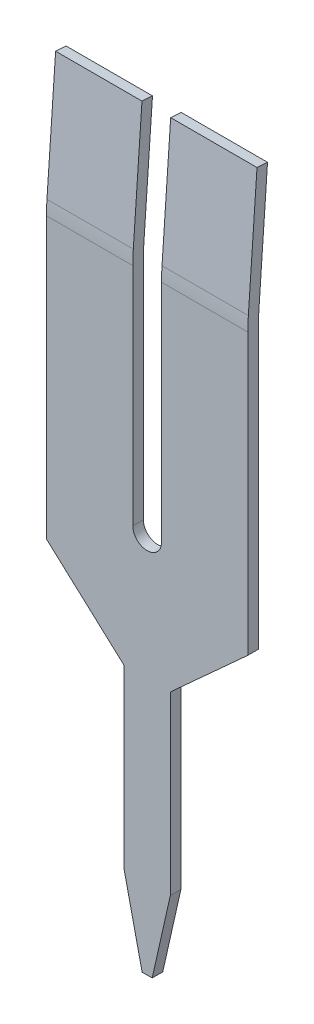
ISO-10303-21;
HEADER;
FILE_DESCRIPTION(('STEP AP214'),'2;1');
FILE_NAME('part.step','',(''),(''),'','','');
FILE_SCHEMA(('AUTOMOTIVE_DESIGN { 1 0 10303 214 1 1 1 1 }'));
ENDSEC;
DATA;
#1=APPLICATION_CONTEXT('core data for automotive mechanical design processes');
#2=APPLICATION_PROTOCOL_DEFINITION('international standard','automotive_design',2000,#1);
#3=PRODUCT_CONTEXT('',#1,'mechanical');
#4=PRODUCT('Part','Part','',(#3));
#5=PRODUCT_RELATED_PRODUCT_CATEGORY('part','',(#4));
#6=PRODUCT_DEFINITION_FORMATION('','',#4);
#7=PRODUCT_DEFINITION_CONTEXT('part definition',#1,'design');
#8=PRODUCT_DEFINITION('design','',#6,#7);
#9=PRODUCT_DEFINITION_SHAPE('','',#8);
#10=(LENGTH_UNIT() NAMED_UNIT(*) SI_UNIT(.MILLI.,.METRE.));
#11=(NAMED_UNIT(*) PLANE_ANGLE_UNIT() SI_UNIT($,.RADIAN.));
#12=(NAMED_UNIT(*) SI_UNIT($,.STERADIAN.) SOLID_ANGLE_UNIT());
#13=UNCERTAINTY_MEASURE_WITH_UNIT(LENGTH_MEASURE(1.E-05),#10,'distance_accuracy_value','');
#14=(GEOMETRIC_REPRESENTATION_CONTEXT(3) GLOBAL_UNCERTAINTY_ASSIGNED_CONTEXT((#13)) GLOBAL_UNIT_ASSIGNED_CONTEXT((#10,
#11,#12)) REPRESENTATION_CONTEXT('',''));
#15=CARTESIAN_POINT('',(0.,0.,0.));
#16=DIRECTION('',(0.,0.,1.));
#17=DIRECTION('',(1.,0.,0.));
#18=AXIS2_PLACEMENT_3D('',#15,#16,#17);
#19=CARTESIAN_POINT('',(-0.284999999999997,0.,0.21));
#20=DIRECTION('',(-1.,0.,0.));
#21=DIRECTION('',(0.,0.,1.));
#22=AXIS2_PLACEMENT_3D('',#19,#20,#21);
#23=PLANE('',#22);
#24=DIRECTION('',(0.,-0.069756473744124,-0.997564050259824));
#25=VECTOR('',#24,1.);
#26=CARTESIAN_POINT('',(-0.284999999999997,7.19254356862118,-0.292951641518469));
#27=LINE('',#26,#25);
#28=CARTESIAN_POINT('',(-0.284999999999995,7.21500000000001,0.0281902889468723));
#29=VERTEX_POINT('',#28);
#30=CARTESIAN_POINT('',(-0.284999999999995,7.2003868243992,-0.180787858270992));
#31=VERTEX_POINT('',#30);
#32=EDGE_CURVE('E456',#29,#31,#27,.T.);
#33=ORIENTED_EDGE('',*,*,#32,.F.);
#34=DIRECTION('',(0.,0.997564050259824,-0.0697564737441254));
#35=VECTOR('',#34,1.);
#36=CARTESIAN_POINT('',(-0.284999999999995,4.615,0.21));
#37=LINE('',#36,#35);
#38=CARTESIAN_POINT('',(-0.284999999999995,4.75434281700951,0.200256201039297));
#39=VERTEX_POINT('',#38);
#40=EDGE_CURVE('E429',#39,#29,#37,.T.);
#41=ORIENTED_EDGE('',*,*,#40,.F.);
#42=CARTESIAN_POINT('',(-0.284999999999997,4.47531692203301,-3.79));
#43=DIRECTION('',(-1.,0.,0.));
#44=DIRECTION('',(0.,0.,1.));
#45=AXIS2_PLACEMENT_3D('',#42,#43,#44);
#46=CIRCLE('',#45,4.);
#47=CARTESIAN_POINT('',(-0.284999999999997,4.47531692203301,0.21));
#48=VERTEX_POINT('',#47);
#49=EDGE_CURVE('E312',#39,#48,#46,.F.);
#50=ORIENTED_EDGE('',*,*,#49,.T.);
#51=DIRECTION('',(0.,1.,0.));
#52=VECTOR('',#51,1.);
#53=CARTESIAN_POINT('',(-0.284999999999997,0.,0.21));
#54=LINE('',#53,#52);
#55=CARTESIAN_POINT('',(-0.284999999999996,0.,0.21));
#56=VERTEX_POINT('',#55);
#57=EDGE_CURVE('E215',#56,#48,#54,.T.);
#58=ORIENTED_EDGE('',*,*,#57,.F.);
#59=DIRECTION('',(0.,0.,-1.));
#60=VECTOR('',#59,1.);
#61=CARTESIAN_POINT('',(-0.284999999999996,0.,0.21));
#62=LINE('',#61,#60);
#63=CARTESIAN_POINT('',(-0.284999999999996,0.,0.));
#64=VERTEX_POINT('',#63);
#65=EDGE_CURVE('E241',#56,#64,#62,.T.);
#66=ORIENTED_EDGE('',*,*,#65,.T.);
#67=DIRECTION('',(0.,1.,0.));
#68=VECTOR('',#67,1.);
#69=CARTESIAN_POINT('',(-0.284999999999997,0.,0.));
#70=LINE('',#69,#68);
#71=CARTESIAN_POINT('',(-0.284999999999997,4.47531692203302,0.));
#72=VERTEX_POINT('',#71);
#73=EDGE_CURVE('E208',#64,#72,#70,.T.);
#74=ORIENTED_EDGE('',*,*,#73,.T.);
#75=CARTESIAN_POINT('',(-0.284999999999997,4.47531692203302,-4.));
#76=DIRECTION('',(-1.,0.,0.));
#77=DIRECTION('',(0.,0.,1.));
#78=AXIS2_PLACEMENT_3D('',#75,#76,#77);
#79=CIRCLE('',#78,4.);
#80=CARTESIAN_POINT('',(-0.284999999999995,4.75434281700952,-0.00974379896070362));
#81=VERTEX_POINT('',#80);
#82=EDGE_CURVE('E317',#72,#81,#79,.T.);
#83=ORIENTED_EDGE('',*,*,#82,.T.);
#84=DIRECTION('',(0.,0.997564050259824,-0.0697564737441254));
#85=VECTOR('',#84,1.);
#86=CARTESIAN_POINT('',(-0.284999999999995,4.615,0.));
#87=LINE('',#86,#85);
#88=EDGE_CURVE('E432',#81,#31,#87,.T.);
#89=ORIENTED_EDGE('',*,*,#88,.T.);
#90=EDGE_LOOP('',(#33,#41,#50,#58,#66,#74,#83,#89));
#91=FACE_BOUND('',#90,.T.);
#92=ADVANCED_FACE('F35',(#91),#23,.F.);
#93=CARTESIAN_POINT('',(-2.,7.215,0.21));
#94=DIRECTION('',(1.,0.,0.));
#95=DIRECTION('',(0.,1.,0.));
#96=AXIS2_PLACEMENT_3D('',#93,#94,#95);
#97=PLANE('',#96);
#98=DIRECTION('',(0.,-0.069756473744124,-0.997564050259824));
#99=VECTOR('',#98,1.);
#100=CARTESIAN_POINT('',(-2.,7.21500000000001,0.0281902889468721));
#101=LINE('',#100,#99);
#102=CARTESIAN_POINT('',(-1.99999999999999,7.215,0.0281902889468727));
#103=VERTEX_POINT('',#102);
#104=CARTESIAN_POINT('',(-2.,7.2003868243992,-0.180787858270993));
#105=VERTEX_POINT('',#104);
#106=EDGE_CURVE('E204',#103,#105,#101,.T.);
#107=ORIENTED_EDGE('',*,*,#106,.T.);
#108=DIRECTION('',(0.,0.997564050259824,-0.0697564737441254));
#109=VECTOR('',#108,1.);
#110=CARTESIAN_POINT('',(-2.,4.615,0.));
#111=LINE('',#110,#109);
#112=CARTESIAN_POINT('',(-2.,4.75434281700952,-0.00974379896070362));
#113=VERTEX_POINT('',#112);
#114=EDGE_CURVE('E433',#113,#105,#111,.T.);
#115=ORIENTED_EDGE('',*,*,#114,.F.);
#116=CARTESIAN_POINT('',(-2.,4.47531692203302,-4.));
#117=DIRECTION('',(1.,0.,0.));
#118=DIRECTION('',(0.,1.,0.));
#119=AXIS2_PLACEMENT_3D('',#116,#117,#118);
#120=CIRCLE('',#119,4.);
#121=CARTESIAN_POINT('',(-2.,4.47531692203302,0.));
#122=VERTEX_POINT('',#121);
#123=EDGE_CURVE('E319',#113,#122,#120,.T.);
#124=ORIENTED_EDGE('',*,*,#123,.T.);
#125=DIRECTION('',(0.,-1.,0.));
#126=VECTOR('',#125,1.);
#127=CARTESIAN_POINT('',(-2.,7.215,0.));
#128=LINE('',#127,#126);
#129=CARTESIAN_POINT('',(-2.,-1.085,0.));
#130=VERTEX_POINT('',#129);
#131=EDGE_CURVE('E211',#122,#130,#128,.T.);
#132=ORIENTED_EDGE('',*,*,#131,.T.);
#133=DIRECTION('',(0.,0.,-1.));
#134=VECTOR('',#133,1.);
#135=CARTESIAN_POINT('',(-2.,-1.085,0.21));
#136=LINE('',#135,#134);
#137=CARTESIAN_POINT('',(-2.,-1.085,0.21));
#138=VERTEX_POINT('',#137);
#139=EDGE_CURVE('E290',#138,#130,#136,.T.);
#140=ORIENTED_EDGE('',*,*,#139,.F.);
#141=DIRECTION('',(0.,-1.,0.));
#142=VECTOR('',#141,1.);
#143=CARTESIAN_POINT('',(-2.,7.215,0.21));
#144=LINE('',#143,#142);
#145=CARTESIAN_POINT('',(-2.,4.47531692203301,0.21));
#146=VERTEX_POINT('',#145);
#147=EDGE_CURVE('E218',#146,#138,#144,.T.);
#148=ORIENTED_EDGE('',*,*,#147,.F.);
#149=CARTESIAN_POINT('',(-2.,4.47531692203301,-3.79));
#150=DIRECTION('',(1.,0.,0.));
#151=DIRECTION('',(0.,1.,0.));
#152=AXIS2_PLACEMENT_3D('',#149,#150,#151);
#153=CIRCLE('',#152,4.);
#154=CARTESIAN_POINT('',(-1.99999999999999,4.75434281700951,0.200256201039297));
#155=VERTEX_POINT('',#154);
#156=EDGE_CURVE('E308',#146,#155,#153,.F.);
#157=ORIENTED_EDGE('',*,*,#156,.T.);
#158=DIRECTION('',(0.,0.997564050259824,-0.0697564737441254));
#159=VECTOR('',#158,1.);
#160=CARTESIAN_POINT('',(-1.99999999999999,4.615,0.21));
#161=LINE('',#160,#159);
#162=EDGE_CURVE('E421',#155,#103,#161,.T.);
#163=ORIENTED_EDGE('',*,*,#162,.T.);
#164=EDGE_LOOP('',(#107,#115,#124,#132,#140,#148,#157,#163));
#165=FACE_BOUND('',#164,.T.);
#166=ADVANCED_FACE('F369',(#165),#97,.F.);
#167=CARTESIAN_POINT('',(2.,-1.085,0.21));
#168=DIRECTION('',(-1.,0.,0.));
#169=DIRECTION('',(0.,-1.,0.));
#170=AXIS2_PLACEMENT_3D('',#167,#168,#169);
#171=PLANE('',#170);
#172=DIRECTION('',(0.,0.069756473744124,0.997564050259824));
#173=VECTOR('',#172,1.);
#174=CARTESIAN_POINT('',(1.99999999999999,7.215,0.0281902889468726));
#175=LINE('',#174,#173);
#176=CARTESIAN_POINT('',(1.99999999999999,7.2003868243992,-0.180787858270992));
#177=VERTEX_POINT('',#176);
#178=CARTESIAN_POINT('',(1.99999999999999,7.215,0.0281902889468726));
#179=VERTEX_POINT('',#178);
#180=EDGE_CURVE('E189',#177,#179,#175,.T.);
#181=ORIENTED_EDGE('',*,*,#180,.T.);
#182=DIRECTION('',(0.,0.997564050259824,-0.0697564737441254));
#183=VECTOR('',#182,1.);
#184=CARTESIAN_POINT('',(1.99999999999999,4.615,0.21));
#185=LINE('',#184,#183);
#186=CARTESIAN_POINT('',(1.99999999999999,4.75434281700951,0.200256201039297));
#187=VERTEX_POINT('',#186);
#188=EDGE_CURVE('E195',#187,#179,#185,.T.);
#189=ORIENTED_EDGE('',*,*,#188,.F.);
#190=CARTESIAN_POINT('',(2.,4.47531692203301,-3.79));
#191=DIRECTION('',(-1.,0.,0.));
#192=DIRECTION('',(0.,-1.,0.));
#193=AXIS2_PLACEMENT_3D('',#190,#191,#192);
#194=CIRCLE('',#193,4.);
#195=CARTESIAN_POINT('',(2.,4.47531692203301,0.21));
#196=VERTEX_POINT('',#195);
#197=EDGE_CURVE('E58',#187,#196,#194,.F.);
#198=ORIENTED_EDGE('',*,*,#197,.T.);
#199=DIRECTION('',(0.,1.,0.));
#200=VECTOR('',#199,1.);
#201=CARTESIAN_POINT('',(2.,-1.085,0.21));
#202=LINE('',#201,#200);
#203=CARTESIAN_POINT('',(2.,-1.085,0.21));
#204=VERTEX_POINT('',#203);
#205=EDGE_CURVE('E235',#204,#196,#202,.T.);
#206=ORIENTED_EDGE('',*,*,#205,.F.);
#207=DIRECTION('',(0.,0.,-1.));
#208=VECTOR('',#207,1.);
#209=CARTESIAN_POINT('',(2.,-1.085,0.21));
#210=LINE('',#209,#208);
#211=CARTESIAN_POINT('',(2.,-1.085,0.));
#212=VERTEX_POINT('',#211);
#213=EDGE_CURVE('E269',#204,#212,#210,.T.);
#214=ORIENTED_EDGE('',*,*,#213,.T.);
#215=DIRECTION('',(0.,1.,0.));
#216=VECTOR('',#215,1.);
#217=CARTESIAN_POINT('',(2.,-1.085,0.));
#218=LINE('',#217,#216);
#219=CARTESIAN_POINT('',(2.,4.47531692203302,0.));
#220=VERTEX_POINT('',#219);
#221=EDGE_CURVE('E258',#212,#220,#218,.T.);
#222=ORIENTED_EDGE('',*,*,#221,.T.);
#223=CARTESIAN_POINT('',(2.,4.47531692203302,-4.));
#224=DIRECTION('',(-1.,0.,0.));
#225=DIRECTION('',(0.,-1.,0.));
#226=AXIS2_PLACEMENT_3D('',#223,#224,#225);
#227=CIRCLE('',#226,4.);
#228=CARTESIAN_POINT('',(2.,4.75434281700952,-0.00974379896070356));
#229=VERTEX_POINT('',#228);
#230=EDGE_CURVE('E323',#220,#229,#227,.T.);
#231=ORIENTED_EDGE('',*,*,#230,.T.);
#232=DIRECTION('',(0.,0.997564050259824,-0.0697564737441254));
#233=VECTOR('',#232,1.);
#234=CARTESIAN_POINT('',(2.,4.615,0.));
#235=LINE('',#234,#233);
#236=EDGE_CURVE('E203',#229,#177,#235,.T.);
#237=ORIENTED_EDGE('',*,*,#236,.T.);
#238=EDGE_LOOP('',(#181,#189,#198,#206,#214,#222,#231,#237));
#239=FACE_BOUND('',#238,.T.);
#240=ADVANCED_FACE('F201',(#239),#171,.F.);
#241=CARTESIAN_POINT('',(0.284999999999995,7.215,0.21));
#242=DIRECTION('',(1.,0.,0.));
#243=DIRECTION('',(0.,1.,0.));
#244=AXIS2_PLACEMENT_3D('',#241,#242,#243);
#245=PLANE('',#244);
#246=DIRECTION('',(0.,0.069756473744124,0.997564050259824));
#247=VECTOR('',#246,1.);
#248=CARTESIAN_POINT('',(0.284999999999995,7.22765151063596,0.209115320194958));
#249=LINE('',#248,#247);
#250=CARTESIAN_POINT('',(0.284999999999995,7.2003868243992,-0.180787858270992));
#251=VERTEX_POINT('',#250);
#252=CARTESIAN_POINT('',(0.284999999999995,7.215,0.0281902889468727));
#253=VERTEX_POINT('',#252);
#254=EDGE_CURVE('E192',#251,#253,#249,.T.);
#255=ORIENTED_EDGE('',*,*,#254,.F.);
#256=DIRECTION('',(0.,0.997564050259824,-0.0697564737441254));
#257=VECTOR('',#256,1.);
#258=CARTESIAN_POINT('',(0.284999999999995,4.615,0.));
#259=LINE('',#258,#257);
#260=CARTESIAN_POINT('',(0.284999999999995,4.75434281700952,-0.00974379896070356));
#261=VERTEX_POINT('',#260);
#262=EDGE_CURVE('E417',#261,#251,#259,.T.);
#263=ORIENTED_EDGE('',*,*,#262,.F.);
#264=CARTESIAN_POINT('',(0.284999999999995,4.47531692203302,-4.));
#265=DIRECTION('',(1.,0.,0.));
#266=DIRECTION('',(0.,1.,0.));
#267=AXIS2_PLACEMENT_3D('',#264,#265,#266);
#268=CIRCLE('',#267,4.);
#269=CARTESIAN_POINT('',(0.284999999999995,4.47531692203302,0.));
#270=VERTEX_POINT('',#269);
#271=EDGE_CURVE('E321',#261,#270,#268,.T.);
#272=ORIENTED_EDGE('',*,*,#271,.T.);
#273=DIRECTION('',(0.,-1.,0.));
#274=VECTOR('',#273,1.);
#275=CARTESIAN_POINT('',(0.284999999999995,7.215,0.));
#276=LINE('',#275,#274);
#277=CARTESIAN_POINT('',(0.284999999999995,0.,0.));
#278=VERTEX_POINT('',#277);
#279=EDGE_CURVE('E261',#270,#278,#276,.T.);
#280=ORIENTED_EDGE('',*,*,#279,.T.);
#281=DIRECTION('',(0.,0.,-1.));
#282=VECTOR('',#281,1.);
#283=CARTESIAN_POINT('',(0.284999999999995,0.,0.21));
#284=LINE('',#283,#282);
#285=CARTESIAN_POINT('',(0.284999999999995,0.,0.21));
#286=VERTEX_POINT('',#285);
#287=EDGE_CURVE('E266',#286,#278,#284,.T.);
#288=ORIENTED_EDGE('',*,*,#287,.F.);
#289=DIRECTION('',(0.,-1.,0.));
#290=VECTOR('',#289,1.);
#291=CARTESIAN_POINT('',(0.284999999999995,7.215,0.21));
#292=LINE('',#291,#290);
#293=CARTESIAN_POINT('',(0.284999999999995,4.47531692203301,0.21));
#294=VERTEX_POINT('',#293);
#295=EDGE_CURVE('E238',#294,#286,#292,.T.);
#296=ORIENTED_EDGE('',*,*,#295,.F.);
#297=CARTESIAN_POINT('',(0.284999999999995,4.47531692203301,-3.79));
#298=DIRECTION('',(1.,0.,0.));
#299=DIRECTION('',(0.,1.,0.));
#300=AXIS2_PLACEMENT_3D('',#297,#298,#299);
#301=CIRCLE('',#300,4.);
#302=CARTESIAN_POINT('',(0.284999999999995,4.75434281700951,0.200256201039297));
#303=VERTEX_POINT('',#302);
#304=EDGE_CURVE('E50',#294,#303,#301,.F.);
#305=ORIENTED_EDGE('',*,*,#304,.T.);
#306=DIRECTION('',(0.,0.997564050259824,-0.0697564737441254));
#307=VECTOR('',#306,1.);
#308=CARTESIAN_POINT('',(0.284999999999995,4.615,0.21));
#309=LINE('',#308,#307);
#310=EDGE_CURVE('E196',#303,#253,#309,.T.);
#311=ORIENTED_EDGE('',*,*,#310,.T.);
#312=EDGE_LOOP('',(#255,#263,#272,#280,#288,#296,#305,#311));
#313=FACE_BOUND('',#312,.T.);
#314=ADVANCED_FACE('F413',(#313),#245,.F.);
#315=CARTESIAN_POINT('',(2.,4.615,0.));
#316=DIRECTION('',(0.,-0.0697564737441254,-0.997564050259824));
#317=DIRECTION('',(0.,0.997564050259824,-0.0697564737441254));
#318=AXIS2_PLACEMENT_3D('',#315,#316,#317);
#319=PLANE('',#318);
#320=CARTESIAN_POINT('',(1.1425,5.26975010199334,-0.0457845872520827));
#321=DIRECTION('',(0.,-0.0697564737441254,-0.997564050259824));
#322=DIRECTION('',(0.,0.997564050259824,-0.0697564737441254));
#323=AXIS2_PLACEMENT_3D('',#320,#321,#322);
#324=CIRCLE('',#323,0.356281411877177);
#325=CARTESIAN_POINT('',(1.1425,5.62516363025783,-0.0706375222052129));
#326=VERTEX_POINT('',#325);
#327=EDGE_CURVE('E43',#326,#326,#324,.F.);
#328=ORIENTED_EDGE('',*,*,#327,.T.);
#329=EDGE_LOOP('',(#328));
#330=FACE_BOUND('',#329,.T.);
#331=CARTESIAN_POINT('',(1.1425,6.26731415225317,-0.115541060996208));
#332=DIRECTION('',(0.,-0.0697564737441254,-0.997564050259824));
#333=DIRECTION('',(0.,0.997564050259824,-0.0697564737441254));
#334=AXIS2_PLACEMENT_3D('',#331,#332,#333);
#335=CIRCLE('',#334,0.356281411877177);
#336=CARTESIAN_POINT('',(1.1425,6.62272768051765,-0.140393995949338));
#337=VERTEX_POINT('',#336);
#338=EDGE_CURVE('E334',#337,#337,#335,.F.);
#339=ORIENTED_EDGE('',*,*,#338,.T.);
#340=EDGE_LOOP('',(#339));
#341=FACE_BOUND('',#340,.T.);
#342=ORIENTED_EDGE('',*,*,#262,.T.);
#343=DIRECTION('',(1.,0.,0.));
#344=VECTOR('',#343,1.);
#345=CARTESIAN_POINT('',(1.99999999999999,7.2003868243992,-0.180787858270992));
#346=LINE('',#345,#344);
#347=EDGE_CURVE('E418',#251,#177,#346,.T.);
#348=ORIENTED_EDGE('',*,*,#347,.T.);
#349=ORIENTED_EDGE('',*,*,#236,.F.);
#350=DIRECTION('',(-1.,0.,0.));
#351=VECTOR('',#350,1.);
#352=CARTESIAN_POINT('',(0.284999999999996,4.75434281700952,-0.00974379896070356));
#353=LINE('',#352,#351);
#354=EDGE_CURVE('E300',#229,#261,#353,.T.);
#355=ORIENTED_EDGE('',*,*,#354,.T.);
#356=EDGE_LOOP('',(#342,#348,#349,#355));
#357=FACE_BOUND('',#356,.T.);
#358=ADVANCED_FACE('F339',(#330,#341,#357),#319,.T.);
#359=CARTESIAN_POINT('',(-2.,4.615,0.));
#360=DIRECTION('',(0.,-0.0697564737441254,-0.997564050259824));
#361=DIRECTION('',(0.,0.997564050259824,-0.0697564737441254));
#362=AXIS2_PLACEMENT_3D('',#359,#360,#361);
#363=PLANE('',#362);
#364=CARTESIAN_POINT('',(-1.1425,5.26975010199334,-0.0457845872520827));
#365=DIRECTION('',(0.,0.0697564737441254,0.997564050259824));
#366=DIRECTION('',(0.,0.997564050259824,-0.0697564737441254));
#367=AXIS2_PLACEMENT_3D('',#364,#365,#366);
#368=CIRCLE('',#367,0.356281411877177);
#369=CARTESIAN_POINT('',(-1.1425,5.62516363025783,-0.0706375222052129));
#370=VERTEX_POINT('',#369);
#371=EDGE_CURVE('E453',#370,#370,#368,.F.);
#372=ORIENTED_EDGE('',*,*,#371,.F.);
#373=EDGE_LOOP('',(#372));
#374=FACE_BOUND('',#373,.T.);
#375=CARTESIAN_POINT('',(-1.1425,6.26731415225317,-0.115541060996208));
#376=DIRECTION('',(0.,0.0697564737441254,0.997564050259824));
#377=DIRECTION('',(0.,0.997564050259824,-0.0697564737441254));
#378=AXIS2_PLACEMENT_3D('',#375,#376,#377);
#379=CIRCLE('',#378,0.356281411877177);
#380=CARTESIAN_POINT('',(-1.1425,6.62272768051765,-0.140393995949338));
#381=VERTEX_POINT('',#380);
#382=EDGE_CURVE('E444',#381,#381,#379,.F.);
#383=ORIENTED_EDGE('',*,*,#382,.F.);
#384=EDGE_LOOP('',(#383));
#385=FACE_BOUND('',#384,.T.);
#386=ORIENTED_EDGE('',*,*,#114,.T.);
#387=EDGE_CURVE('E459',#105,#31,#346,.T.);
#388=ORIENTED_EDGE('',*,*,#387,.T.);
#389=ORIENTED_EDGE('',*,*,#88,.F.);
#390=DIRECTION('',(1.,0.,0.));
#391=VECTOR('',#390,1.);
#392=CARTESIAN_POINT('',(-2.00000000000002,4.75434281700952,-0.00974379896070362));
#393=LINE('',#392,#391);
#394=EDGE_CURVE('E298',#81,#113,#393,.F.);
#395=ORIENTED_EDGE('',*,*,#394,.T.);
#396=EDGE_LOOP('',(#386,#388,#389,#395));
#397=FACE_BOUND('',#396,.T.);
#398=ADVANCED_FACE('F412',(#374,#385,#397),#363,.T.);
#399=CARTESIAN_POINT('',(0.,0.,0.21));
#400=DIRECTION('',(0.,0.,-1.));
#401=DIRECTION('',(-1.,0.,0.));
#402=AXIS2_PLACEMENT_3D('',#399,#400,#401);
#403=PLANE('',#402);
#404=ORIENTED_EDGE('',*,*,#57,.T.);
#405=DIRECTION('',(-1.,0.,0.));
#406=VECTOR('',#405,1.);
#407=CARTESIAN_POINT('',(-2.00000000000002,4.47531692203301,0.21));
#408=LINE('',#407,#406);
#409=EDGE_CURVE('E305',#48,#146,#408,.T.);
#410=ORIENTED_EDGE('',*,*,#409,.T.);
#411=ORIENTED_EDGE('',*,*,#147,.T.);
#412=DIRECTION('',(0.739940073395944,-0.672672793996312,0.));
#413=VECTOR('',#412,1.);
#414=CARTESIAN_POINT('',(-2.,-1.085,0.21));
#415=LINE('',#414,#413);
#416=CARTESIAN_POINT('',(-0.46,-2.48499999999999,0.21));
#417=VERTEX_POINT('',#416);
#418=EDGE_CURVE('E221',#138,#417,#415,.T.);
#419=ORIENTED_EDGE('',*,*,#418,.T.);
#420=DIRECTION('',(0.,-1.,0.));
#421=VECTOR('',#420,1.);
#422=CARTESIAN_POINT('',(-0.46,-2.48499999999999,0.21));
#423=LINE('',#422,#421);
#424=CARTESIAN_POINT('',(-0.46,-5.985,0.21));
#425=VERTEX_POINT('',#424);
#426=EDGE_CURVE('E223',#417,#425,#423,.T.);
#427=ORIENTED_EDGE('',*,*,#426,.T.);
#428=DIRECTION('',(0.219512195121951,-0.975609756097561,0.));
#429=VECTOR('',#428,1.);
#430=CARTESIAN_POINT('',(-0.46,-5.985,0.21));
#431=LINE('',#430,#429);
#432=CARTESIAN_POINT('',(-0.1,-7.585,0.21));
#433=VERTEX_POINT('',#432);
#434=EDGE_CURVE('E225',#425,#433,#431,.T.);
#435=ORIENTED_EDGE('',*,*,#434,.T.);
#436=DIRECTION('',(1.,0.,0.));
#437=VECTOR('',#436,1.);
#438=CARTESIAN_POINT('',(-0.1,-7.585,0.21));
#439=LINE('',#438,#437);
#440=CARTESIAN_POINT('',(0.1,-7.585,0.21));
#441=VERTEX_POINT('',#440);
#442=EDGE_CURVE('E227',#433,#441,#439,.T.);
#443=ORIENTED_EDGE('',*,*,#442,.T.);
#444=DIRECTION('',(0.219512195121951,0.975609756097561,0.));
#445=VECTOR('',#444,1.);
#446=CARTESIAN_POINT('',(0.1,-7.585,0.21));
#447=LINE('',#446,#445);
#448=CARTESIAN_POINT('',(0.46,-5.985,0.21));
#449=VERTEX_POINT('',#448);
#450=EDGE_CURVE('E229',#441,#449,#447,.T.);
#451=ORIENTED_EDGE('',*,*,#450,.T.);
#452=DIRECTION('',(0.,1.,0.));
#453=VECTOR('',#452,1.);
#454=CARTESIAN_POINT('',(0.46,-5.985,0.21));
#455=LINE('',#454,#453);
#456=CARTESIAN_POINT('',(0.46,-2.48499999999999,0.21));
#457=VERTEX_POINT('',#456);
#458=EDGE_CURVE('E231',#449,#457,#455,.T.);
#459=ORIENTED_EDGE('',*,*,#458,.T.);
#460=DIRECTION('',(0.739940073395944,0.672672793996312,0.));
#461=VECTOR('',#460,1.);
#462=CARTESIAN_POINT('',(0.46,-2.48499999999999,0.21));
#463=LINE('',#462,#461);
#464=EDGE_CURVE('E233',#457,#204,#463,.T.);
#465=ORIENTED_EDGE('',*,*,#464,.T.);
#466=ORIENTED_EDGE('',*,*,#205,.T.);
#467=DIRECTION('',(1.,0.,0.));
#468=VECTOR('',#467,1.);
#469=CARTESIAN_POINT('',(0.284999999999995,4.47531692203301,0.21));
#470=LINE('',#469,#468);
#471=EDGE_CURVE('E303',#196,#294,#470,.F.);
#472=ORIENTED_EDGE('',*,*,#471,.T.);
#473=ORIENTED_EDGE('',*,*,#295,.T.);
#474=CARTESIAN_POINT('',(0.,0.,0.21));
#475=DIRECTION('',(0.,0.,-1.));
#476=DIRECTION('',(-1.,0.,0.));
#477=AXIS2_PLACEMENT_3D('',#474,#475,#476);
#478=CIRCLE('',#477,0.284999999999996);
#479=EDGE_CURVE('E240',#286,#56,#478,.T.);
#480=ORIENTED_EDGE('',*,*,#479,.T.);
#481=EDGE_LOOP('',(#404,#410,#411,#419,#427,#435,#443,#451,#459,#465,#466,#472,#473,#480));
#482=FACE_BOUND('',#481,.T.);
#483=ADVANCED_FACE('F489',(#482),#403,.F.);
#484=CARTESIAN_POINT('',(0.,0.,0.));
#485=DIRECTION('',(0.,0.,-1.));
#486=DIRECTION('',(-1.,0.,0.));
#487=AXIS2_PLACEMENT_3D('',#484,#485,#486);
#488=PLANE('',#487);
#489=ORIENTED_EDGE('',*,*,#131,.F.);
#490=DIRECTION('',(1.,0.,0.));
#491=VECTOR('',#490,1.);
#492=CARTESIAN_POINT('',(-0.284999999999997,4.47531692203302,0.));
#493=LINE('',#492,#491);
#494=EDGE_CURVE('E295',#122,#72,#493,.T.);
#495=ORIENTED_EDGE('',*,*,#494,.T.);
#496=ORIENTED_EDGE('',*,*,#73,.F.);
#497=CARTESIAN_POINT('',(0.,0.,0.));
#498=DIRECTION('',(0.,0.,-1.));
#499=DIRECTION('',(-1.,0.,0.));
#500=AXIS2_PLACEMENT_3D('',#497,#498,#499);
#501=CIRCLE('',#500,0.284999999999996);
#502=EDGE_CURVE('E219',#278,#64,#501,.T.);
#503=ORIENTED_EDGE('',*,*,#502,.F.);
#504=ORIENTED_EDGE('',*,*,#279,.F.);
#505=DIRECTION('',(-1.,0.,0.));
#506=VECTOR('',#505,1.);
#507=CARTESIAN_POINT('',(2.,4.47531692203302,0.));
#508=LINE('',#507,#506);
#509=EDGE_CURVE('E293',#270,#220,#508,.F.);
#510=ORIENTED_EDGE('',*,*,#509,.T.);
#511=ORIENTED_EDGE('',*,*,#221,.F.);
#512=DIRECTION('',(0.739940073395944,0.672672793996312,0.));
#513=VECTOR('',#512,1.);
#514=CARTESIAN_POINT('',(0.46,-2.48499999999999,0.));
#515=LINE('',#514,#513);
#516=CARTESIAN_POINT('',(0.46,-2.48499999999999,0.));
#517=VERTEX_POINT('',#516);
#518=EDGE_CURVE('E256',#517,#212,#515,.T.);
#519=ORIENTED_EDGE('',*,*,#518,.F.);
#520=DIRECTION('',(0.,1.,0.));
#521=VECTOR('',#520,1.);
#522=CARTESIAN_POINT('',(0.46,-5.985,0.));
#523=LINE('',#522,#521);
#524=CARTESIAN_POINT('',(0.46,-5.985,0.));
#525=VERTEX_POINT('',#524);
#526=EDGE_CURVE('E254',#525,#517,#523,.T.);
#527=ORIENTED_EDGE('',*,*,#526,.F.);
#528=DIRECTION('',(0.219512195121951,0.975609756097561,0.));
#529=VECTOR('',#528,1.);
#530=CARTESIAN_POINT('',(0.1,-7.585,0.));
#531=LINE('',#530,#529);
#532=CARTESIAN_POINT('',(0.1,-7.585,0.));
#533=VERTEX_POINT('',#532);
#534=EDGE_CURVE('E252',#533,#525,#531,.T.);
#535=ORIENTED_EDGE('',*,*,#534,.F.);
#536=DIRECTION('',(1.,0.,0.));
#537=VECTOR('',#536,1.);
#538=CARTESIAN_POINT('',(-0.1,-7.585,0.));
#539=LINE('',#538,#537);
#540=CARTESIAN_POINT('',(-0.1,-7.585,0.));
#541=VERTEX_POINT('',#540);
#542=EDGE_CURVE('E250',#541,#533,#539,.T.);
#543=ORIENTED_EDGE('',*,*,#542,.F.);
#544=DIRECTION('',(0.219512195121951,-0.975609756097561,0.));
#545=VECTOR('',#544,1.);
#546=CARTESIAN_POINT('',(-0.46,-5.985,0.));
#547=LINE('',#546,#545);
#548=CARTESIAN_POINT('',(-0.46,-5.985,0.));
#549=VERTEX_POINT('',#548);
#550=EDGE_CURVE('E248',#549,#541,#547,.T.);
#551=ORIENTED_EDGE('',*,*,#550,.F.);
#552=DIRECTION('',(0.,-1.,0.));
#553=VECTOR('',#552,1.);
#554=CARTESIAN_POINT('',(-0.46,-2.48499999999999,0.));
#555=LINE('',#554,#553);
#556=CARTESIAN_POINT('',(-0.46,-2.48499999999999,0.));
#557=VERTEX_POINT('',#556);
#558=EDGE_CURVE('E246',#557,#549,#555,.T.);
#559=ORIENTED_EDGE('',*,*,#558,.F.);
#560=DIRECTION('',(0.739940073395944,-0.672672793996312,0.));
#561=VECTOR('',#560,1.);
#562=CARTESIAN_POINT('',(-2.,-1.085,0.));
#563=LINE('',#562,#561);
#564=EDGE_CURVE('E244',#130,#557,#563,.T.);
#565=ORIENTED_EDGE('',*,*,#564,.F.);
#566=EDGE_LOOP('',(#489,#495,#496,#503,#504,#510,#511,#519,#527,#535,#543,#551,#559,#565));
#567=FACE_BOUND('',#566,.T.);
#568=ADVANCED_FACE('F475',(#567),#488,.T.);
#569=CARTESIAN_POINT('',(-2.,-1.085,0.21));
#570=DIRECTION('',(0.672672793996312,0.739940073395944,0.));
#571=DIRECTION('',(-0.739940073395944,0.672672793996312,0.));
#572=AXIS2_PLACEMENT_3D('',#569,#570,#571);
#573=PLANE('',#572);
#574=ORIENTED_EDGE('',*,*,#564,.T.);
#575=DIRECTION('',(0.,0.,-1.));
#576=VECTOR('',#575,1.);
#577=CARTESIAN_POINT('',(-0.46,-2.48499999999999,0.21));
#578=LINE('',#577,#576);
#579=EDGE_CURVE('E287',#417,#557,#578,.T.);
#580=ORIENTED_EDGE('',*,*,#579,.F.);
#581=ORIENTED_EDGE('',*,*,#418,.F.);
#582=ORIENTED_EDGE('',*,*,#139,.T.);
#583=EDGE_LOOP('',(#574,#580,#581,#582));
#584=FACE_BOUND('',#583,.T.);
#585=ADVANCED_FACE('F481',(#584),#573,.F.);
#586=CARTESIAN_POINT('',(-0.46,-2.48499999999999,0.21));
#587=DIRECTION('',(1.,0.,0.));
#588=DIRECTION('',(0.,0.,-1.));
#589=AXIS2_PLACEMENT_3D('',#586,#587,#588);
#590=PLANE('',#589);
#591=ORIENTED_EDGE('',*,*,#558,.T.);
#592=DIRECTION('',(0.,0.,-1.));
#593=VECTOR('',#592,1.);
#594=CARTESIAN_POINT('',(-0.46,-5.985,0.21));
#595=LINE('',#594,#593);
#596=EDGE_CURVE('E284',#425,#549,#595,.T.);
#597=ORIENTED_EDGE('',*,*,#596,.F.);
#598=ORIENTED_EDGE('',*,*,#426,.F.);
#599=ORIENTED_EDGE('',*,*,#579,.T.);
#600=EDGE_LOOP('',(#591,#597,#598,#599));
#601=FACE_BOUND('',#600,.T.);
#602=ADVANCED_FACE('F485',(#601),#590,.F.);
#603=CARTESIAN_POINT('',(-0.46,-5.985,0.21));
#604=DIRECTION('',(0.975609756097561,0.219512195121951,0.));
#605=DIRECTION('',(-0.219512195121951,0.975609756097561,0.));
#606=AXIS2_PLACEMENT_3D('',#603,#604,#605);
#607=PLANE('',#606);
#608=ORIENTED_EDGE('',*,*,#550,.T.);
#609=DIRECTION('',(0.,0.,-1.));
#610=VECTOR('',#609,1.);
#611=CARTESIAN_POINT('',(-0.1,-7.585,0.21));
#612=LINE('',#611,#610);
#613=EDGE_CURVE('E281',#433,#541,#612,.T.);
#614=ORIENTED_EDGE('',*,*,#613,.F.);
#615=ORIENTED_EDGE('',*,*,#434,.F.);
#616=ORIENTED_EDGE('',*,*,#596,.T.);
#617=EDGE_LOOP('',(#608,#614,#615,#616));
#618=FACE_BOUND('',#617,.T.);
#619=ADVANCED_FACE('F530',(#618),#607,.F.);
#620=CARTESIAN_POINT('',(-0.1,-7.585,0.21));
#621=DIRECTION('',(0.,1.,0.));
#622=DIRECTION('',(0.,0.,1.));
#623=AXIS2_PLACEMENT_3D('',#620,#621,#622);
#624=PLANE('',#623);
#625=ORIENTED_EDGE('',*,*,#542,.T.);
#626=DIRECTION('',(0.,0.,-1.));
#627=VECTOR('',#626,1.);
#628=CARTESIAN_POINT('',(0.1,-7.585,0.21));
#629=LINE('',#628,#627);
#630=EDGE_CURVE('E278',#441,#533,#629,.T.);
#631=ORIENTED_EDGE('',*,*,#630,.F.);
#632=ORIENTED_EDGE('',*,*,#442,.F.);
#633=ORIENTED_EDGE('',*,*,#613,.T.);
#634=EDGE_LOOP('',(#625,#631,#632,#633));
#635=FACE_BOUND('',#634,.T.);
#636=ADVANCED_FACE('F527',(#635),#624,.F.);
#637=CARTESIAN_POINT('',(0.1,-7.585,0.21));
#638=DIRECTION('',(-0.975609756097561,0.219512195121951,0.));
#639=DIRECTION('',(-0.219512195121951,-0.975609756097561,0.));
#640=AXIS2_PLACEMENT_3D('',#637,#638,#639);
#641=PLANE('',#640);
#642=ORIENTED_EDGE('',*,*,#534,.T.);
#643=DIRECTION('',(0.,0.,-1.));
#644=VECTOR('',#643,1.);
#645=CARTESIAN_POINT('',(0.46,-5.985,0.21));
#646=LINE('',#645,#644);
#647=EDGE_CURVE('E275',#449,#525,#646,.T.);
#648=ORIENTED_EDGE('',*,*,#647,.F.);
#649=ORIENTED_EDGE('',*,*,#450,.F.);
#650=ORIENTED_EDGE('',*,*,#630,.T.);
#651=EDGE_LOOP('',(#642,#648,#649,#650));
#652=FACE_BOUND('',#651,.T.);
#653=ADVANCED_FACE('F523',(#652),#641,.F.);
#654=CARTESIAN_POINT('',(0.46,-5.985,0.21));
#655=DIRECTION('',(-1.,0.,0.));
#656=DIRECTION('',(0.,0.,1.));
#657=AXIS2_PLACEMENT_3D('',#654,#655,#656);
#658=PLANE('',#657);
#659=ORIENTED_EDGE('',*,*,#526,.T.);
#660=DIRECTION('',(0.,0.,-1.));
#661=VECTOR('',#660,1.);
#662=CARTESIAN_POINT('',(0.46,-2.48499999999999,0.21));
#663=LINE('',#662,#661);
#664=EDGE_CURVE('E272',#457,#517,#663,.T.);
#665=ORIENTED_EDGE('',*,*,#664,.F.);
#666=ORIENTED_EDGE('',*,*,#458,.F.);
#667=ORIENTED_EDGE('',*,*,#647,.T.);
#668=EDGE_LOOP('',(#659,#665,#666,#667));
#669=FACE_BOUND('',#668,.T.);
#670=ADVANCED_FACE('F519',(#669),#658,.F.);
#671=CARTESIAN_POINT('',(0.46,-2.48499999999999,0.21));
#672=DIRECTION('',(-0.672672793996312,0.739940073395944,0.));
#673=DIRECTION('',(-0.739940073395944,-0.672672793996312,0.));
#674=AXIS2_PLACEMENT_3D('',#671,#672,#673);
#675=PLANE('',#674);
#676=ORIENTED_EDGE('',*,*,#518,.T.);
#677=ORIENTED_EDGE('',*,*,#213,.F.);
#678=ORIENTED_EDGE('',*,*,#464,.F.);
#679=ORIENTED_EDGE('',*,*,#664,.T.);
#680=EDGE_LOOP('',(#676,#677,#678,#679));
#681=FACE_BOUND('',#680,.T.);
#682=ADVANCED_FACE('F514',(#681),#675,.F.);
#683=CARTESIAN_POINT('',(0.,0.,0.21));
#684=DIRECTION('',(0.,0.,-1.));
#685=DIRECTION('',(-1.,0.,0.));
#686=AXIS2_PLACEMENT_3D('',#683,#684,#685);
#687=CYLINDRICAL_SURFACE('',#686,0.284999999999996);
#688=ORIENTED_EDGE('',*,*,#502,.T.);
#689=ORIENTED_EDGE('',*,*,#65,.F.);
#690=ORIENTED_EDGE('',*,*,#479,.F.);
#691=ORIENTED_EDGE('',*,*,#287,.T.);
#692=EDGE_LOOP('',(#688,#689,#690,#691));
#693=FACE_BOUND('',#692,.T.);
#694=ADVANCED_FACE('F502',(#693),#687,.F.);
#695=CARTESIAN_POINT('',(0.284999999999995,4.615,0.21));
#696=DIRECTION('',(0.,0.0697564737441254,0.997564050259824));
#697=DIRECTION('',(0.,-0.997564050259824,0.0697564737441254));
#698=AXIS2_PLACEMENT_3D('',#695,#696,#697);
#699=PLANE('',#698);
#700=ORIENTED_EDGE('',*,*,#310,.F.);
#701=DIRECTION('',(1.,0.,0.));
#702=VECTOR('',#701,1.);
#703=CARTESIAN_POINT('',(1.99999999999999,4.75434281700951,0.200256201039297));
#704=LINE('',#703,#702);
#705=EDGE_CURVE('E207',#303,#187,#704,.T.);
#706=ORIENTED_EDGE('',*,*,#705,.T.);
#707=ORIENTED_EDGE('',*,*,#188,.T.);
#708=DIRECTION('',(1.,0.,0.));
#709=VECTOR('',#708,1.);
#710=CARTESIAN_POINT('',(0.284999999999995,7.215,0.0281902889468727));
#711=LINE('',#710,#709);
#712=EDGE_CURVE('E186',#253,#179,#711,.T.);
#713=ORIENTED_EDGE('',*,*,#712,.F.);
#714=EDGE_LOOP('',(#700,#706,#707,#713));
#715=FACE_BOUND('',#714,.T.);
#716=ADVANCED_FACE('F206',(#715),#699,.T.);
#717=CARTESIAN_POINT('',(-0.284999999999995,4.615,0.21));
#718=DIRECTION('',(0.,0.0697564737441254,0.997564050259824));
#719=DIRECTION('',(0.,-0.997564050259824,0.0697564737441254));
#720=AXIS2_PLACEMENT_3D('',#717,#718,#719);
#721=PLANE('',#720);
#722=ORIENTED_EDGE('',*,*,#162,.F.);
#723=DIRECTION('',(-1.,0.,0.));
#724=VECTOR('',#723,1.);
#725=CARTESIAN_POINT('',(-0.284999999999996,4.75434281700951,0.200256201039297));
#726=LINE('',#725,#724);
#727=EDGE_CURVE('E310',#155,#39,#726,.F.);
#728=ORIENTED_EDGE('',*,*,#727,.T.);
#729=ORIENTED_EDGE('',*,*,#40,.T.);
#730=DIRECTION('',(-1.,0.,0.));
#731=VECTOR('',#730,1.);
#732=CARTESIAN_POINT('',(-0.284999999999995,7.215,0.0281902889468727));
#733=LINE('',#732,#731);
#734=EDGE_CURVE('E426',#29,#103,#733,.T.);
#735=ORIENTED_EDGE('',*,*,#734,.T.);
#736=EDGE_LOOP('',(#722,#728,#729,#735));
#737=FACE_BOUND('',#736,.T.);
#738=ADVANCED_FACE('F384',(#737),#721,.T.);
#739=CARTESIAN_POINT('',(0.,4.47531692203302,-4.));
#740=DIRECTION('',(-1.,0.,0.));
#741=DIRECTION('',(0.,-1.,0.));
#742=AXIS2_PLACEMENT_3D('',#739,#740,#741);
#743=CYLINDRICAL_SURFACE('',#742,4.);
#744=ORIENTED_EDGE('',*,*,#123,.F.);
#745=ORIENTED_EDGE('',*,*,#394,.F.);
#746=ORIENTED_EDGE('',*,*,#82,.F.);
#747=ORIENTED_EDGE('',*,*,#494,.F.);
#748=EDGE_LOOP('',(#744,#745,#746,#747));
#749=FACE_BOUND('',#748,.T.);
#750=ADVANCED_FACE('F380',(#749),#743,.F.);
#751=CARTESIAN_POINT('',(2.,4.47531692203302,-4.));
#752=DIRECTION('',(1.,0.,0.));
#753=DIRECTION('',(0.,1.,0.));
#754=AXIS2_PLACEMENT_3D('',#751,#752,#753);
#755=CYLINDRICAL_SURFACE('',#754,4.);
#756=ORIENTED_EDGE('',*,*,#230,.F.);
#757=ORIENTED_EDGE('',*,*,#509,.F.);
#758=ORIENTED_EDGE('',*,*,#271,.F.);
#759=ORIENTED_EDGE('',*,*,#354,.F.);
#760=EDGE_LOOP('',(#756,#757,#758,#759));
#761=FACE_BOUND('',#760,.T.);
#762=ADVANCED_FACE('F383',(#761),#755,.F.);
#763=CARTESIAN_POINT('',(0.,4.47531692203301,-3.79));
#764=DIRECTION('',(1.,0.,0.));
#765=DIRECTION('',(0.,1.,0.));
#766=AXIS2_PLACEMENT_3D('',#763,#764,#765);
#767=CYLINDRICAL_SURFACE('',#766,4.);
#768=ORIENTED_EDGE('',*,*,#49,.F.);
#769=ORIENTED_EDGE('',*,*,#727,.F.);
#770=ORIENTED_EDGE('',*,*,#156,.F.);
#771=ORIENTED_EDGE('',*,*,#409,.F.);
#772=EDGE_LOOP('',(#768,#769,#770,#771));
#773=FACE_BOUND('',#772,.T.);
#774=ADVANCED_FACE('F365',(#773),#767,.T.);
#775=CARTESIAN_POINT('',(0.284999999999995,4.47531692203301,-3.79));
#776=DIRECTION('',(-1.,0.,0.));
#777=DIRECTION('',(0.,-1.,0.));
#778=AXIS2_PLACEMENT_3D('',#775,#776,#777);
#779=CYLINDRICAL_SURFACE('',#778,4.);
#780=ORIENTED_EDGE('',*,*,#304,.F.);
#781=ORIENTED_EDGE('',*,*,#471,.F.);
#782=ORIENTED_EDGE('',*,*,#197,.F.);
#783=ORIENTED_EDGE('',*,*,#705,.F.);
#784=EDGE_LOOP('',(#780,#781,#782,#783));
#785=FACE_BOUND('',#784,.T.);
#786=ADVANCED_FACE('F357',(#785),#779,.T.);
#787=CARTESIAN_POINT('',(1.1425,5.28021357305496,0.103850020286891));
#788=DIRECTION('',(0.,-0.0697564737441254,-0.997564050259824));
#789=DIRECTION('',(0.,0.997564050259824,-0.0697564737441254));
#790=AXIS2_PLACEMENT_3D('',#787,#788,#789);
#791=PLANE('',#790);
#792=CARTESIAN_POINT('',(1.1425,5.28021357305496,0.103850020286891));
#793=DIRECTION('',(0.,-0.0697564737441254,-0.997564050259824));
#794=DIRECTION('',(0.,0.997564050259824,-0.0697564737441254));
#795=AXIS2_PLACEMENT_3D('',#792,#793,#794);
#796=CIRCLE('',#795,0.0208712152522085);
#797=CARTESIAN_POINT('',(1.1425,5.3010339470758,0.102394117908142));
#798=VERTEX_POINT('',#797);
#799=EDGE_CURVE('E325',#798,#798,#796,.T.);
#800=ORIENTED_EDGE('',*,*,#799,.T.);
#801=EDGE_LOOP('',(#800));
#802=FACE_BOUND('',#801,.T.);
#803=ADVANCED_FACE('F355',(#802),#791,.T.);
#804=CARTESIAN_POINT('',(1.1425,6.27777762331479,0.0340935465427654));
#805=DIRECTION('',(0.,-0.0697564737441254,-0.997564050259824));
#806=DIRECTION('',(0.,0.997564050259824,-0.0697564737441254));
#807=AXIS2_PLACEMENT_3D('',#804,#805,#806);
#808=PLANE('',#807);
#809=CARTESIAN_POINT('',(1.1425,6.27777762331479,0.0340935465427654));
#810=DIRECTION('',(0.,-0.0697564737441254,-0.997564050259824));
#811=DIRECTION('',(0.,0.997564050259824,-0.0697564737441254));
#812=AXIS2_PLACEMENT_3D('',#809,#810,#811);
#813=CIRCLE('',#812,0.0208712152522085);
#814=CARTESIAN_POINT('',(1.1425,6.29859799733562,0.0326376441640168));
#815=VERTEX_POINT('',#814);
#816=EDGE_CURVE('E328',#815,#815,#813,.T.);
#817=ORIENTED_EDGE('',*,*,#816,.T.);
#818=EDGE_LOOP('',(#817));
#819=FACE_BOUND('',#818,.T.);
#820=ADVANCED_FACE('F351',(#819),#808,.T.);
#821=CARTESIAN_POINT('',(1.1425,5.26277445461893,-0.145540992278065));
#822=DIRECTION('',(0.,0.0697564737441254,0.997564050259824));
#823=DIRECTION('',(0.,-0.997564050259824,0.0697564737441254));
#824=AXIS2_PLACEMENT_3D('',#821,#822,#823);
#825=DEGENERATE_TOROIDAL_SURFACE('',#824,0.0208712152522085,0.25,.T.);
#826=CARTESIAN_POINT('',(1.1425,5.27440053357629,0.0207196827652389));
#827=DIRECTION('',(0.,-0.0697564737441254,-0.997564050259824));
#828=DIRECTION('',(0.,0.997564050259824,-0.0697564737441254));
#829=AXIS2_PLACEMENT_3D('',#826,#827,#828);
#830=CIRCLE('',#829,0.207210213377191);
#831=CARTESIAN_POINT('',(1.1425,5.48110599328804,0.00626542895627823));
#832=VERTEX_POINT('',#831);
#833=EDGE_CURVE('E331',#832,#832,#830,.T.);
#834=ORIENTED_EDGE('',*,*,#833,.T.);
#835=EDGE_LOOP('',(#834));
#836=FACE_BOUND('',#835,.T.);
#837=ORIENTED_EDGE('',*,*,#799,.F.);
#838=EDGE_LOOP('',(#837));
#839=FACE_BOUND('',#838,.T.);
#840=ADVANCED_FACE('F348',(#836,#839),#825,.F.);
#841=CARTESIAN_POINT('',(1.1425,6.26033850487875,-0.215297466022191));
#842=DIRECTION('',(0.,0.0697564737441254,0.997564050259824));
#843=DIRECTION('',(0.,-0.997564050259824,0.0697564737441254));
#844=AXIS2_PLACEMENT_3D('',#841,#842,#843);
#845=DEGENERATE_TOROIDAL_SURFACE('',#844,0.0208712152522085,0.25,.T.);
#846=CARTESIAN_POINT('',(1.1425,6.27196458383611,-0.0490367909788866));
#847=DIRECTION('',(0.,-0.0697564737441254,-0.997564050259824));
#848=DIRECTION('',(0.,0.997564050259824,-0.0697564737441254));
#849=AXIS2_PLACEMENT_3D('',#846,#847,#848);
#850=CIRCLE('',#849,0.207210213377191);
#851=CARTESIAN_POINT('',(1.1425,6.47867004354786,-0.0634910447878472));
#852=VERTEX_POINT('',#851);
#853=EDGE_CURVE('E11',#852,#852,#850,.T.);
#854=ORIENTED_EDGE('',*,*,#853,.T.);
#855=EDGE_LOOP('',(#854));
#856=FACE_BOUND('',#855,.T.);
#857=ORIENTED_EDGE('',*,*,#816,.F.);
#858=EDGE_LOOP('',(#857));
#859=FACE_BOUND('',#858,.T.);
#860=ADVANCED_FACE('F345',(#856,#859),#845,.F.);
#861=CARTESIAN_POINT('',(1.1425,5.28370139674217,0.153728222799882));
#862=DIRECTION('',(0.,-0.0697564737441254,-0.997564050259824));
#863=DIRECTION('',(0.,0.997564050259824,-0.0697564737441254));
#864=AXIS2_PLACEMENT_3D('',#861,#862,#863);
#865=TOROIDAL_SURFACE('',#864,0.356281411877177,0.2);
#866=ORIENTED_EDGE('',*,*,#327,.F.);
#867=EDGE_LOOP('',(#866));
#868=FACE_BOUND('',#867,.T.);
#869=ORIENTED_EDGE('',*,*,#833,.F.);
#870=EDGE_LOOP('',(#869));
#871=FACE_BOUND('',#870,.T.);
#872=ADVANCED_FACE('F342',(#868,#871),#865,.T.);
#873=CARTESIAN_POINT('',(1.1425,6.28126544700199,0.0839717490557567));
#874=DIRECTION('',(0.,-0.0697564737441254,-0.997564050259824));
#875=DIRECTION('',(0.,0.997564050259824,-0.0697564737441254));
#876=AXIS2_PLACEMENT_3D('',#873,#874,#875);
#877=TOROIDAL_SURFACE('',#876,0.356281411877177,0.2);
#878=ORIENTED_EDGE('',*,*,#338,.F.);
#879=EDGE_LOOP('',(#878));
#880=FACE_BOUND('',#879,.T.);
#881=ORIENTED_EDGE('',*,*,#853,.F.);
#882=EDGE_LOOP('',(#881));
#883=FACE_BOUND('',#882,.T.);
#884=ADVANCED_FACE('F37',(#880,#883),#877,.T.);
#885=CARTESIAN_POINT('',(-1.1425,6.27777762331479,0.0340935465427654));
#886=DIRECTION('',(0.,-0.0697564737441254,-0.997564050259824));
#887=DIRECTION('',(0.,0.997564050259824,-0.0697564737441254));
#888=AXIS2_PLACEMENT_3D('',#885,#886,#887);
#889=PLANE('',#888);
#890=CARTESIAN_POINT('',(-1.1425,6.27777762331479,0.0340935465427654));
#891=DIRECTION('',(0.,0.0697564737441254,0.997564050259824));
#892=DIRECTION('',(0.,0.997564050259824,-0.0697564737441254));
#893=AXIS2_PLACEMENT_3D('',#890,#891,#892);
#894=CIRCLE('',#893,0.0208712152522085);
#895=CARTESIAN_POINT('',(-1.1425,6.29859799733562,0.0326376441640168));
#896=VERTEX_POINT('',#895);
#897=EDGE_CURVE('E436',#896,#896,#894,.T.);
#898=ORIENTED_EDGE('',*,*,#897,.F.);
#899=EDGE_LOOP('',(#898));
#900=FACE_BOUND('',#899,.T.);
#901=ADVANCED_FACE('F401',(#900),#889,.T.);
#902=CARTESIAN_POINT('',(-1.1425,6.28126544700199,0.0839717490557567));
#903=DIRECTION('',(0.,-0.0697564737441254,-0.997564050259824));
#904=DIRECTION('',(0.,0.997564050259824,-0.0697564737441254));
#905=AXIS2_PLACEMENT_3D('',#902,#903,#904);
#906=TOROIDAL_SURFACE('',#905,0.356281411877177,0.2);
#907=ORIENTED_EDGE('',*,*,#382,.T.);
#908=EDGE_LOOP('',(#907));
#909=FACE_BOUND('',#908,.T.);
#910=CARTESIAN_POINT('',(-1.1425,6.27196458383611,-0.0490367909788866));
#911=DIRECTION('',(0.,0.0697564737441254,0.997564050259824));
#912=DIRECTION('',(0.,0.997564050259824,-0.0697564737441254));
#913=AXIS2_PLACEMENT_3D('',#910,#911,#912);
#914=CIRCLE('',#913,0.207210213377191);
#915=CARTESIAN_POINT('',(-1.1425,6.47867004354786,-0.0634910447878472));
#916=VERTEX_POINT('',#915);
#917=EDGE_CURVE('E441',#916,#916,#914,.T.);
#918=ORIENTED_EDGE('',*,*,#917,.T.);
#919=EDGE_LOOP('',(#918));
#920=FACE_BOUND('',#919,.T.);
#921=ADVANCED_FACE('F406',(#909,#920),#906,.T.);
#922=CARTESIAN_POINT('',(-1.1425,6.26033850487875,-0.215297466022191));
#923=DIRECTION('',(0.,0.0697564737441254,0.997564050259824));
#924=DIRECTION('',(0.,-0.997564050259824,0.0697564737441254));
#925=AXIS2_PLACEMENT_3D('',#922,#923,#924);
#926=DEGENERATE_TOROIDAL_SURFACE('',#925,0.0208712152522085,0.25,.T.);
#927=ORIENTED_EDGE('',*,*,#917,.F.);
#928=EDGE_LOOP('',(#927));
#929=FACE_BOUND('',#928,.T.);
#930=ORIENTED_EDGE('',*,*,#897,.T.);
#931=EDGE_LOOP('',(#930));
#932=FACE_BOUND('',#931,.T.);
#933=ADVANCED_FACE('F660',(#929,#932),#926,.F.);
#934=CARTESIAN_POINT('',(-1.1425,5.28021357305496,0.103850020286891));
#935=DIRECTION('',(0.,-0.0697564737441254,-0.997564050259824));
#936=DIRECTION('',(0.,0.997564050259824,-0.0697564737441254));
#937=AXIS2_PLACEMENT_3D('',#934,#935,#936);
#938=PLANE('',#937);
#939=CARTESIAN_POINT('',(-1.1425,5.28021357305496,0.103850020286891));
#940=DIRECTION('',(0.,0.0697564737441254,0.997564050259824));
#941=DIRECTION('',(0.,0.997564050259824,-0.0697564737441254));
#942=AXIS2_PLACEMENT_3D('',#939,#940,#941);
#943=CIRCLE('',#942,0.0208712152522085);
#944=CARTESIAN_POINT('',(-1.1425,5.3010339470758,0.102394117908142));
#945=VERTEX_POINT('',#944);
#946=EDGE_CURVE('E447',#945,#945,#943,.T.);
#947=ORIENTED_EDGE('',*,*,#946,.F.);
#948=EDGE_LOOP('',(#947));
#949=FACE_BOUND('',#948,.T.);
#950=ADVANCED_FACE('F671',(#949),#938,.T.);
#951=CARTESIAN_POINT('',(-1.1425,5.28370139674217,0.153728222799882));
#952=DIRECTION('',(0.,-0.0697564737441254,-0.997564050259824));
#953=DIRECTION('',(0.,0.997564050259824,-0.0697564737441254));
#954=AXIS2_PLACEMENT_3D('',#951,#952,#953);
#955=TOROIDAL_SURFACE('',#954,0.356281411877177,0.2);
#956=ORIENTED_EDGE('',*,*,#371,.T.);
#957=EDGE_LOOP('',(#956));
#958=FACE_BOUND('',#957,.T.);
#959=CARTESIAN_POINT('',(-1.1425,5.27440053357629,0.0207196827652389));
#960=DIRECTION('',(0.,0.0697564737441254,0.997564050259824));
#961=DIRECTION('',(0.,0.997564050259824,-0.0697564737441254));
#962=AXIS2_PLACEMENT_3D('',#959,#960,#961);
#963=CIRCLE('',#962,0.207210213377191);
#964=CARTESIAN_POINT('',(-1.1425,5.48110599328804,0.00626542895627823));
#965=VERTEX_POINT('',#964);
#966=EDGE_CURVE('E450',#965,#965,#963,.T.);
#967=ORIENTED_EDGE('',*,*,#966,.T.);
#968=EDGE_LOOP('',(#967));
#969=FACE_BOUND('',#968,.T.);
#970=ADVANCED_FACE('F681',(#958,#969),#955,.T.);
#971=CARTESIAN_POINT('',(-1.1425,5.26277445461893,-0.145540992278065));
#972=DIRECTION('',(0.,0.0697564737441254,0.997564050259824));
#973=DIRECTION('',(0.,-0.997564050259824,0.0697564737441254));
#974=AXIS2_PLACEMENT_3D('',#971,#972,#973);
#975=DEGENERATE_TOROIDAL_SURFACE('',#974,0.0208712152522085,0.25,.T.);
#976=ORIENTED_EDGE('',*,*,#966,.F.);
#977=EDGE_LOOP('',(#976));
#978=FACE_BOUND('',#977,.T.);
#979=ORIENTED_EDGE('',*,*,#946,.T.);
#980=EDGE_LOOP('',(#979));
#981=FACE_BOUND('',#980,.T.);
#982=ADVANCED_FACE('F692',(#978,#981),#975,.F.);
#983=CARTESIAN_POINT('',(0.,7.17793039302037,-0.501929788736334));
#984=DIRECTION('',(0.,0.997564050259824,-0.069756473744124));
#985=DIRECTION('',(0.,0.069756473744124,0.997564050259824));
#986=AXIS2_PLACEMENT_3D('',#983,#984,#985);
#987=PLANE('',#986);
#988=ORIENTED_EDGE('',*,*,#32,.T.);
#989=ORIENTED_EDGE('',*,*,#387,.F.);
#990=ORIENTED_EDGE('',*,*,#106,.F.);
#991=ORIENTED_EDGE('',*,*,#734,.F.);
#992=EDGE_LOOP('',(#988,#989,#990,#991));
#993=FACE_BOUND('',#992,.T.);
#994=ADVANCED_FACE('F701',(#993),#987,.T.);
#995=ORIENTED_EDGE('',*,*,#254,.T.);
#996=ORIENTED_EDGE('',*,*,#712,.T.);
#997=ORIENTED_EDGE('',*,*,#180,.F.);
#998=ORIENTED_EDGE('',*,*,#347,.F.);
#999=EDGE_LOOP('',(#995,#996,#997,#998));
#1000=FACE_BOUND('',#999,.T.);
#1001=ADVANCED_FACE('F188',(#1000),#987,.T.);
#1002=CLOSED_SHELL('',(#92,#166,#240,#314,#358,#398,#483,#568,#585,#602,#619,#636,#653,#670,
#682,#694,#716,#738,#750,#762,#774,#786,#803,#820,#840,#860,#872,#884,#901,#921,#933,#950,#970,
#982,#994,#1001));
#1003=MANIFOLD_SOLID_BREP('B2',#1002);
#1004=ADVANCED_BREP_SHAPE_REPRESENTATION('',(#18,#1003),#14);
#1005=SHAPE_DEFINITION_REPRESENTATION(#9,#1004);
ENDSEC;
END-ISO-10303-21;
